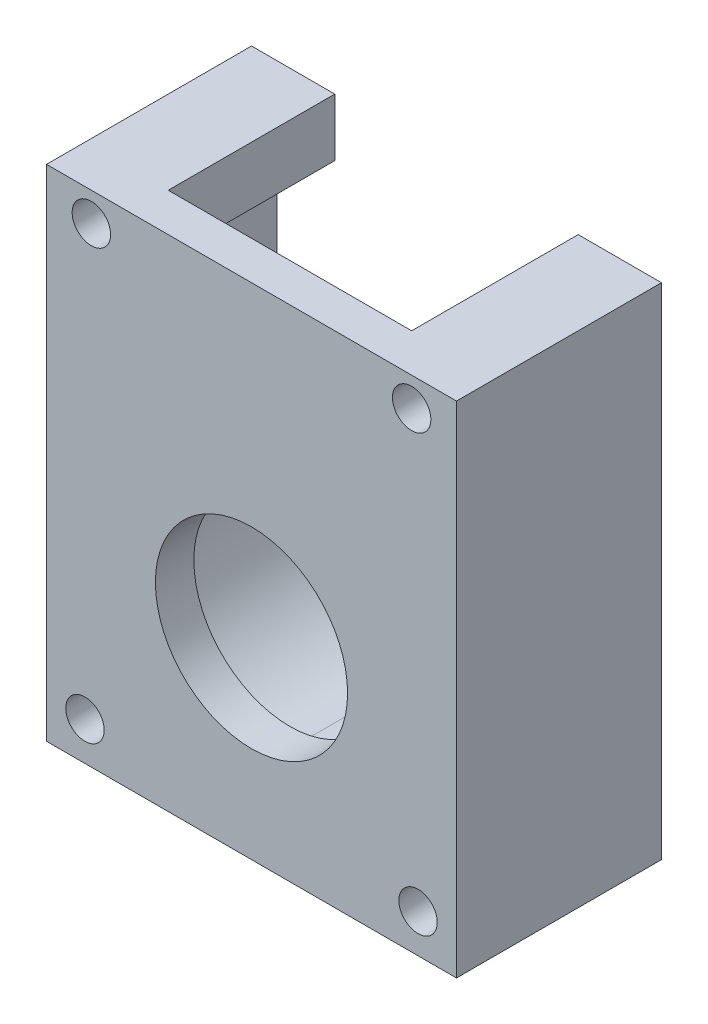
ISO-10303-21;
HEADER;
FILE_DESCRIPTION(('STEP AP214'),'2;1');
FILE_NAME('part.step','',(''),(''),'','','');
FILE_SCHEMA(('AUTOMOTIVE_DESIGN { 1 0 10303 214 1 1 1 1 }'));
ENDSEC;
DATA;
#1=APPLICATION_CONTEXT('core data for automotive mechanical design processes');
#2=APPLICATION_PROTOCOL_DEFINITION('international standard','automotive_design',2000,#1);
#3=PRODUCT_CONTEXT('',#1,'mechanical');
#4=PRODUCT('Part','Part','',(#3));
#5=PRODUCT_RELATED_PRODUCT_CATEGORY('part','',(#4));
#6=PRODUCT_DEFINITION_FORMATION('','',#4);
#7=PRODUCT_DEFINITION_CONTEXT('part definition',#1,'design');
#8=PRODUCT_DEFINITION('design','',#6,#7);
#9=PRODUCT_DEFINITION_SHAPE('','',#8);
#10=(LENGTH_UNIT() NAMED_UNIT(*) SI_UNIT(.MILLI.,.METRE.));
#11=(NAMED_UNIT(*) PLANE_ANGLE_UNIT() SI_UNIT($,.RADIAN.));
#12=(NAMED_UNIT(*) SI_UNIT($,.STERADIAN.) SOLID_ANGLE_UNIT());
#13=UNCERTAINTY_MEASURE_WITH_UNIT(LENGTH_MEASURE(1.E-05),#10,'distance_accuracy_value','');
#14=(GEOMETRIC_REPRESENTATION_CONTEXT(3) GLOBAL_UNCERTAINTY_ASSIGNED_CONTEXT((#13)) GLOBAL_UNIT_ASSIGNED_CONTEXT((#10,
#11,#12)) REPRESENTATION_CONTEXT('',''));
#15=CARTESIAN_POINT('',(0.,0.,0.));
#16=DIRECTION('',(0.,0.,1.));
#17=DIRECTION('',(1.,0.,0.));
#18=AXIS2_PLACEMENT_3D('',#15,#16,#17);
#19=CARTESIAN_POINT('',(14.,0.,19.));
#20=DIRECTION('',(-1.,0.,0.));
#21=DIRECTION('',(0.,0.,1.));
#22=AXIS2_PLACEMENT_3D('',#19,#20,#21);
#23=PLANE('',#22);
#24=DIRECTION('',(0.,0.,-1.));
#25=VECTOR('',#24,1.);
#26=CARTESIAN_POINT('',(14.,-3.,19.));
#27=LINE('',#26,#25);
#28=CARTESIAN_POINT('',(14.,-3.,0.));
#29=VERTEX_POINT('',#28);
#30=CARTESIAN_POINT('',(14.,-3.,13.));
#31=VERTEX_POINT('',#30);
#32=EDGE_CURVE('E193',#29,#31,#27,.F.);
#33=ORIENTED_EDGE('',*,*,#32,.T.);
#34=DIRECTION('',(0.,1.,0.));
#35=VECTOR('',#34,1.);
#36=CARTESIAN_POINT('',(14.,0.,13.));
#37=LINE('',#36,#35);
#38=CARTESIAN_POINT('',(14.,18.5,13.));
#39=VERTEX_POINT('',#38);
#40=EDGE_CURVE('E335',#31,#39,#37,.T.);
#41=ORIENTED_EDGE('',*,*,#40,.T.);
#42=DIRECTION('',(0.,0.,1.));
#43=VECTOR('',#42,1.);
#44=CARTESIAN_POINT('',(14.,18.5,0.));
#45=LINE('',#44,#43);
#46=CARTESIAN_POINT('',(14.,18.5,0.));
#47=VERTEX_POINT('',#46);
#48=EDGE_CURVE('E206',#39,#47,#45,.F.);
#49=ORIENTED_EDGE('',*,*,#48,.T.);
#50=DIRECTION('',(0.,1.,0.));
#51=VECTOR('',#50,1.);
#52=CARTESIAN_POINT('',(14.,0.,0.));
#53=LINE('',#52,#51);
#54=EDGE_CURVE('E266',#29,#47,#53,.T.);
#55=ORIENTED_EDGE('',*,*,#54,.F.);
#56=EDGE_LOOP('',(#33,#41,#49,#55));
#57=FACE_BOUND('',#56,.T.);
#58=ADVANCED_FACE('F39',(#57),#23,.T.);
#59=CARTESIAN_POINT('',(0.,-13.,19.));
#60=DIRECTION('',(0.,1.,0.));
#61=DIRECTION('',(0.,0.,1.));
#62=AXIS2_PLACEMENT_3D('',#59,#60,#61);
#63=PLANE('',#62);
#64=DIRECTION('',(0.,0.,-1.));
#65=VECTOR('',#64,1.);
#66=CARTESIAN_POINT('',(-4.,-13.,19.));
#67=LINE('',#66,#65);
#68=CARTESIAN_POINT('',(-4.,-13.,0.));
#69=VERTEX_POINT('',#68);
#70=CARTESIAN_POINT('',(-4.,-13.,13.));
#71=VERTEX_POINT('',#70);
#72=EDGE_CURVE('E186',#69,#71,#67,.F.);
#73=ORIENTED_EDGE('',*,*,#72,.T.);
#74=DIRECTION('',(1.,0.,0.));
#75=VECTOR('',#74,1.);
#76=CARTESIAN_POINT('',(0.,-13.,13.));
#77=LINE('',#76,#75);
#78=CARTESIAN_POINT('',(4.,-13.,13.));
#79=VERTEX_POINT('',#78);
#80=EDGE_CURVE('E312',#71,#79,#77,.T.);
#81=ORIENTED_EDGE('',*,*,#80,.T.);
#82=DIRECTION('',(0.,0.,-1.));
#83=VECTOR('',#82,1.);
#84=CARTESIAN_POINT('',(4.,-13.,0.));
#85=LINE('',#84,#83);
#86=CARTESIAN_POINT('',(4.,-13.,0.));
#87=VERTEX_POINT('',#86);
#88=EDGE_CURVE('E191',#79,#87,#85,.T.);
#89=ORIENTED_EDGE('',*,*,#88,.T.);
#90=DIRECTION('',(1.,0.,0.));
#91=VECTOR('',#90,1.);
#92=CARTESIAN_POINT('',(0.,-13.,0.));
#93=LINE('',#92,#91);
#94=EDGE_CURVE('E269',#69,#87,#93,.T.);
#95=ORIENTED_EDGE('',*,*,#94,.F.);
#96=EDGE_LOOP('',(#73,#81,#89,#95));
#97=FACE_BOUND('',#96,.T.);
#98=ADVANCED_FACE('F342',(#97),#63,.T.);
#99=CARTESIAN_POINT('',(-14.,0.,19.));
#100=DIRECTION('',(-1.,0.,0.));
#101=DIRECTION('',(0.,0.,1.));
#102=AXIS2_PLACEMENT_3D('',#99,#100,#101);
#103=PLANE('',#102);
#104=DIRECTION('',(0.,1.,0.));
#105=VECTOR('',#104,1.);
#106=CARTESIAN_POINT('',(-14.,0.,13.));
#107=LINE('',#106,#105);
#108=CARTESIAN_POINT('',(-14.,-3.,13.));
#109=VERTEX_POINT('',#108);
#110=CARTESIAN_POINT('',(-14.,18.5,13.));
#111=VERTEX_POINT('',#110);
#112=EDGE_CURVE('E301',#109,#111,#107,.T.);
#113=ORIENTED_EDGE('',*,*,#112,.F.);
#114=DIRECTION('',(0.,0.,-1.));
#115=VECTOR('',#114,1.);
#116=CARTESIAN_POINT('',(-14.,-3.,19.));
#117=LINE('',#116,#115);
#118=CARTESIAN_POINT('',(-14.,-3.,0.));
#119=VERTEX_POINT('',#118);
#120=EDGE_CURVE('E179',#109,#119,#117,.T.);
#121=ORIENTED_EDGE('',*,*,#120,.T.);
#122=DIRECTION('',(0.,1.,0.));
#123=VECTOR('',#122,1.);
#124=CARTESIAN_POINT('',(-14.,0.,0.));
#125=LINE('',#124,#123);
#126=CARTESIAN_POINT('',(-14.,18.5,0.));
#127=VERTEX_POINT('',#126);
#128=EDGE_CURVE('E272',#119,#127,#125,.T.);
#129=ORIENTED_EDGE('',*,*,#128,.T.);
#130=DIRECTION('',(0.,0.,1.));
#131=VECTOR('',#130,1.);
#132=CARTESIAN_POINT('',(-14.,18.5,19.));
#133=LINE('',#132,#131);
#134=EDGE_CURVE('E198',#127,#111,#133,.T.);
#135=ORIENTED_EDGE('',*,*,#134,.T.);
#136=EDGE_LOOP('',(#113,#121,#129,#135));
#137=FACE_BOUND('',#136,.T.);
#138=ADVANCED_FACE('F300',(#137),#103,.F.);
#139=CARTESIAN_POINT('',(-9.5,24.,0.));
#140=DIRECTION('',(1.,0.,0.));
#141=DIRECTION('',(0.,0.,-1.));
#142=AXIS2_PLACEMENT_3D('',#139,#140,#141);
#143=PLANE('',#142);
#144=DIRECTION('',(0.,0.,1.));
#145=VECTOR('',#144,1.);
#146=CARTESIAN_POINT('',(-9.5,24.,0.));
#147=LINE('',#146,#145);
#148=CARTESIAN_POINT('',(-9.5,24.,0.));
#149=VERTEX_POINT('',#148);
#150=CARTESIAN_POINT('',(-9.5,24.,13.));
#151=VERTEX_POINT('',#150);
#152=EDGE_CURVE('E56',#149,#151,#147,.T.);
#153=ORIENTED_EDGE('',*,*,#152,.T.);
#154=DIRECTION('',(0.,-1.,0.));
#155=VECTOR('',#154,1.);
#156=CARTESIAN_POINT('',(-9.5,24.,13.));
#157=LINE('',#156,#155);
#158=CARTESIAN_POINT('',(-9.5,19.5,13.));
#159=VERTEX_POINT('',#158);
#160=EDGE_CURVE('E60',#151,#159,#157,.T.);
#161=ORIENTED_EDGE('',*,*,#160,.T.);
#162=DIRECTION('',(0.,0.,1.));
#163=VECTOR('',#162,1.);
#164=CARTESIAN_POINT('',(-9.5,19.5,0.));
#165=LINE('',#164,#163);
#166=CARTESIAN_POINT('',(-9.5,19.5,0.));
#167=VERTEX_POINT('',#166);
#168=EDGE_CURVE('E254',#167,#159,#165,.T.);
#169=ORIENTED_EDGE('',*,*,#168,.F.);
#170=DIRECTION('',(0.,1.,0.));
#171=VECTOR('',#170,1.);
#172=CARTESIAN_POINT('',(-9.5,24.,0.));
#173=LINE('',#172,#171);
#174=EDGE_CURVE('E252',#167,#149,#173,.T.);
#175=ORIENTED_EDGE('',*,*,#174,.T.);
#176=EDGE_LOOP('',(#153,#161,#169,#175));
#177=FACE_BOUND('',#176,.T.);
#178=ADVANCED_FACE('F287',(#177),#143,.T.);
#179=CARTESIAN_POINT('',(-14.,19.5,0.));
#180=DIRECTION('',(0.,-1.,0.));
#181=DIRECTION('',(0.,0.,-1.));
#182=AXIS2_PLACEMENT_3D('',#179,#180,#181);
#183=PLANE('',#182);
#184=ORIENTED_EDGE('',*,*,#168,.T.);
#185=DIRECTION('',(-1.,0.,0.));
#186=VECTOR('',#185,1.);
#187=CARTESIAN_POINT('',(-14.,19.5,13.));
#188=LINE('',#187,#186);
#189=CARTESIAN_POINT('',(-13.,19.5,13.));
#190=VERTEX_POINT('',#189);
#191=EDGE_CURVE('E310',#159,#190,#188,.T.);
#192=ORIENTED_EDGE('',*,*,#191,.T.);
#193=DIRECTION('',(0.,0.,1.));
#194=VECTOR('',#193,1.);
#195=CARTESIAN_POINT('',(-13.,19.5,0.));
#196=LINE('',#195,#194);
#197=CARTESIAN_POINT('',(-13.,19.5,0.));
#198=VERTEX_POINT('',#197);
#199=EDGE_CURVE('E201',#190,#198,#196,.F.);
#200=ORIENTED_EDGE('',*,*,#199,.T.);
#201=DIRECTION('',(1.,0.,0.));
#202=VECTOR('',#201,1.);
#203=CARTESIAN_POINT('',(-14.,19.5,0.));
#204=LINE('',#203,#202);
#205=EDGE_CURVE('E248',#198,#167,#204,.T.);
#206=ORIENTED_EDGE('',*,*,#205,.T.);
#207=EDGE_LOOP('',(#184,#192,#200,#206));
#208=FACE_BOUND('',#207,.T.);
#209=ADVANCED_FACE('F359',(#208),#183,.T.);
#210=CARTESIAN_POINT('',(14.,19.5,0.));
#211=DIRECTION('',(0.,-1.,0.));
#212=DIRECTION('',(0.,0.,-1.));
#213=AXIS2_PLACEMENT_3D('',#210,#211,#212);
#214=PLANE('',#213);
#215=DIRECTION('',(0.,0.,1.));
#216=VECTOR('',#215,1.);
#217=CARTESIAN_POINT('',(13.,19.5,19.));
#218=LINE('',#217,#216);
#219=CARTESIAN_POINT('',(13.,19.5,0.));
#220=VERTEX_POINT('',#219);
#221=CARTESIAN_POINT('',(13.,19.5,13.));
#222=VERTEX_POINT('',#221);
#223=EDGE_CURVE('E203',#220,#222,#218,.T.);
#224=ORIENTED_EDGE('',*,*,#223,.T.);
#225=DIRECTION('',(-1.,0.,0.));
#226=VECTOR('',#225,1.);
#227=CARTESIAN_POINT('',(14.,19.5,13.));
#228=LINE('',#227,#226);
#229=CARTESIAN_POINT('',(9.5,19.5,13.));
#230=VERTEX_POINT('',#229);
#231=EDGE_CURVE('E328',#222,#230,#228,.T.);
#232=ORIENTED_EDGE('',*,*,#231,.T.);
#233=DIRECTION('',(0.,0.,1.));
#234=VECTOR('',#233,1.);
#235=CARTESIAN_POINT('',(9.5,19.5,0.));
#236=LINE('',#235,#234);
#237=CARTESIAN_POINT('',(9.5,19.5,0.));
#238=VERTEX_POINT('',#237);
#239=EDGE_CURVE('E245',#238,#230,#236,.T.);
#240=ORIENTED_EDGE('',*,*,#239,.F.);
#241=DIRECTION('',(1.,0.,0.));
#242=VECTOR('',#241,1.);
#243=CARTESIAN_POINT('',(14.,19.5,0.));
#244=LINE('',#243,#242);
#245=EDGE_CURVE('E241',#238,#220,#244,.T.);
#246=ORIENTED_EDGE('',*,*,#245,.T.);
#247=EDGE_LOOP('',(#224,#232,#240,#246));
#248=FACE_BOUND('',#247,.T.);
#249=ADVANCED_FACE('F357',(#248),#214,.T.);
#250=CARTESIAN_POINT('',(9.5,24.,0.));
#251=DIRECTION('',(-1.,0.,0.));
#252=DIRECTION('',(0.,0.,1.));
#253=AXIS2_PLACEMENT_3D('',#250,#251,#252);
#254=PLANE('',#253);
#255=ORIENTED_EDGE('',*,*,#239,.T.);
#256=DIRECTION('',(0.,1.,0.));
#257=VECTOR('',#256,1.);
#258=CARTESIAN_POINT('',(9.5,24.,13.));
#259=LINE('',#258,#257);
#260=CARTESIAN_POINT('',(9.5,24.,13.));
#261=VERTEX_POINT('',#260);
#262=EDGE_CURVE('E323',#230,#261,#259,.T.);
#263=ORIENTED_EDGE('',*,*,#262,.T.);
#264=DIRECTION('',(0.,0.,1.));
#265=VECTOR('',#264,1.);
#266=CARTESIAN_POINT('',(9.5,24.,0.));
#267=LINE('',#266,#265);
#268=CARTESIAN_POINT('',(9.5,24.,0.));
#269=VERTEX_POINT('',#268);
#270=EDGE_CURVE('E244',#269,#261,#267,.T.);
#271=ORIENTED_EDGE('',*,*,#270,.F.);
#272=DIRECTION('',(0.,-1.,0.));
#273=VECTOR('',#272,1.);
#274=CARTESIAN_POINT('',(9.5,24.,0.));
#275=LINE('',#274,#273);
#276=EDGE_CURVE('E238',#269,#238,#275,.T.);
#277=ORIENTED_EDGE('',*,*,#276,.T.);
#278=EDGE_LOOP('',(#255,#263,#271,#277));
#279=FACE_BOUND('',#278,.T.);
#280=ADVANCED_FACE('F321',(#279),#254,.T.);
#281=CARTESIAN_POINT('',(-4.,-3.,19.));
#282=DIRECTION('',(0.,0.,-1.));
#283=DIRECTION('',(-1.,0.,0.));
#284=AXIS2_PLACEMENT_3D('',#281,#282,#283);
#285=CYLINDRICAL_SURFACE('',#284,10.);
#286=CARTESIAN_POINT('',(-4.,-3.,13.));
#287=DIRECTION('',(0.,0.,1.));
#288=DIRECTION('',(1.,0.,0.));
#289=AXIS2_PLACEMENT_3D('',#286,#287,#288);
#290=CIRCLE('',#289,10.);
#291=EDGE_CURVE('E308',#71,#109,#290,.F.);
#292=ORIENTED_EDGE('',*,*,#291,.F.);
#293=ORIENTED_EDGE('',*,*,#72,.F.);
#294=CARTESIAN_POINT('',(-4.,-3.,0.));
#295=DIRECTION('',(0.,0.,1.));
#296=DIRECTION('',(1.,0.,0.));
#297=AXIS2_PLACEMENT_3D('',#294,#295,#296);
#298=CIRCLE('',#297,10.);
#299=EDGE_CURVE('E189',#119,#69,#298,.T.);
#300=ORIENTED_EDGE('',*,*,#299,.F.);
#301=ORIENTED_EDGE('',*,*,#120,.F.);
#302=EDGE_LOOP('',(#292,#293,#300,#301));
#303=FACE_BOUND('',#302,.T.);
#304=ADVANCED_FACE('F365',(#303),#285,.F.);
#305=CARTESIAN_POINT('',(4.,-3.,19.));
#306=DIRECTION('',(0.,0.,1.));
#307=DIRECTION('',(1.,0.,0.));
#308=AXIS2_PLACEMENT_3D('',#305,#306,#307);
#309=CYLINDRICAL_SURFACE('',#308,10.);
#310=CARTESIAN_POINT('',(4.,-3.,13.));
#311=DIRECTION('',(0.,0.,1.));
#312=DIRECTION('',(1.,0.,0.));
#313=AXIS2_PLACEMENT_3D('',#310,#311,#312);
#314=CIRCLE('',#313,10.);
#315=EDGE_CURVE('E337',#31,#79,#314,.F.);
#316=ORIENTED_EDGE('',*,*,#315,.F.);
#317=ORIENTED_EDGE('',*,*,#32,.F.);
#318=CARTESIAN_POINT('',(4.,-3.,0.));
#319=DIRECTION('',(0.,0.,1.));
#320=DIRECTION('',(1.,0.,0.));
#321=AXIS2_PLACEMENT_3D('',#318,#319,#320);
#322=CIRCLE('',#321,10.);
#323=EDGE_CURVE('E196',#87,#29,#322,.T.);
#324=ORIENTED_EDGE('',*,*,#323,.F.);
#325=ORIENTED_EDGE('',*,*,#88,.F.);
#326=EDGE_LOOP('',(#316,#317,#324,#325));
#327=FACE_BOUND('',#326,.T.);
#328=ADVANCED_FACE('F347',(#327),#309,.F.);
#329=CARTESIAN_POINT('',(-13.,18.5,19.));
#330=DIRECTION('',(0.,0.,1.));
#331=DIRECTION('',(1.,0.,0.));
#332=AXIS2_PLACEMENT_3D('',#329,#330,#331);
#333=CYLINDRICAL_SURFACE('',#332,1.);
#334=CARTESIAN_POINT('',(-13.,18.5,13.));
#335=DIRECTION('',(0.,0.,1.));
#336=DIRECTION('',(1.,0.,0.));
#337=AXIS2_PLACEMENT_3D('',#334,#335,#336);
#338=CIRCLE('',#337,1.);
#339=EDGE_CURVE('E297',#111,#190,#338,.F.);
#340=ORIENTED_EDGE('',*,*,#339,.F.);
#341=ORIENTED_EDGE('',*,*,#134,.F.);
#342=CARTESIAN_POINT('',(-13.,18.5,0.));
#343=DIRECTION('',(0.,0.,1.));
#344=DIRECTION('',(1.,0.,0.));
#345=AXIS2_PLACEMENT_3D('',#342,#343,#344);
#346=CIRCLE('',#345,1.);
#347=EDGE_CURVE('E48',#198,#127,#346,.T.);
#348=ORIENTED_EDGE('',*,*,#347,.F.);
#349=ORIENTED_EDGE('',*,*,#199,.F.);
#350=EDGE_LOOP('',(#340,#341,#348,#349));
#351=FACE_BOUND('',#350,.T.);
#352=ADVANCED_FACE('F295',(#351),#333,.F.);
#353=CARTESIAN_POINT('',(13.,18.5,0.));
#354=DIRECTION('',(0.,0.,-1.));
#355=DIRECTION('',(-1.,0.,0.));
#356=AXIS2_PLACEMENT_3D('',#353,#354,#355);
#357=CYLINDRICAL_SURFACE('',#356,1.);
#358=CARTESIAN_POINT('',(13.,18.5,13.));
#359=DIRECTION('',(0.,0.,1.));
#360=DIRECTION('',(1.,0.,0.));
#361=AXIS2_PLACEMENT_3D('',#358,#359,#360);
#362=CIRCLE('',#361,1.);
#363=EDGE_CURVE('E325',#222,#39,#362,.F.);
#364=ORIENTED_EDGE('',*,*,#363,.F.);
#365=ORIENTED_EDGE('',*,*,#223,.F.);
#366=CARTESIAN_POINT('',(13.,18.5,0.));
#367=DIRECTION('',(0.,0.,1.));
#368=DIRECTION('',(1.,0.,0.));
#369=AXIS2_PLACEMENT_3D('',#366,#367,#368);
#370=CIRCLE('',#369,1.);
#371=EDGE_CURVE('E11',#47,#220,#370,.T.);
#372=ORIENTED_EDGE('',*,*,#371,.F.);
#373=ORIENTED_EDGE('',*,*,#48,.F.);
#374=EDGE_LOOP('',(#364,#365,#372,#373));
#375=FACE_BOUND('',#374,.T.);
#376=ADVANCED_FACE('F41',(#375),#357,.F.);
#377=CARTESIAN_POINT('',(-16.,0.,19.));
#378=DIRECTION('',(-1.,0.,0.));
#379=DIRECTION('',(0.,0.,1.));
#380=AXIS2_PLACEMENT_3D('',#377,#378,#379);
#381=PLANE('',#380);
#382=DIRECTION('',(0.,0.,-1.));
#383=VECTOR('',#382,1.);
#384=CARTESIAN_POINT('',(-16.,24.,19.));
#385=LINE('',#384,#383);
#386=CARTESIAN_POINT('',(-16.,24.,16.));
#387=VERTEX_POINT('',#386);
#388=CARTESIAN_POINT('',(-16.,24.,0.));
#389=VERTEX_POINT('',#388);
#390=EDGE_CURVE('E181',#387,#389,#385,.T.);
#391=ORIENTED_EDGE('',*,*,#390,.T.);
#392=DIRECTION('',(0.,1.,0.));
#393=VECTOR('',#392,1.);
#394=CARTESIAN_POINT('',(-16.,0.,0.));
#395=LINE('',#394,#393);
#396=CARTESIAN_POINT('',(-16.,-15.,0.));
#397=VERTEX_POINT('',#396);
#398=EDGE_CURVE('E256',#397,#389,#395,.T.);
#399=ORIENTED_EDGE('',*,*,#398,.F.);
#400=DIRECTION('',(0.,0.,-1.));
#401=VECTOR('',#400,1.);
#402=CARTESIAN_POINT('',(-16.,-15.,19.));
#403=LINE('',#402,#401);
#404=CARTESIAN_POINT('',(-16.,-15.,16.));
#405=VERTEX_POINT('',#404);
#406=EDGE_CURVE('E177',#405,#397,#403,.T.);
#407=ORIENTED_EDGE('',*,*,#406,.F.);
#408=DIRECTION('',(0.,1.,0.));
#409=VECTOR('',#408,1.);
#410=CARTESIAN_POINT('',(-16.,-15.,16.));
#411=LINE('',#410,#409);
#412=EDGE_CURVE('E160',#405,#387,#411,.T.);
#413=ORIENTED_EDGE('',*,*,#412,.T.);
#414=EDGE_LOOP('',(#391,#399,#407,#413));
#415=FACE_BOUND('',#414,.T.);
#416=ADVANCED_FACE('F277',(#415),#381,.T.);
#417=CARTESIAN_POINT('',(0.,-15.,19.));
#418=DIRECTION('',(0.,1.,0.));
#419=DIRECTION('',(0.,0.,1.));
#420=AXIS2_PLACEMENT_3D('',#417,#418,#419);
#421=PLANE('',#420);
#422=ORIENTED_EDGE('',*,*,#406,.T.);
#423=DIRECTION('',(1.,0.,0.));
#424=VECTOR('',#423,1.);
#425=CARTESIAN_POINT('',(0.,-15.,0.));
#426=LINE('',#425,#424);
#427=CARTESIAN_POINT('',(16.,-15.,0.));
#428=VERTEX_POINT('',#427);
#429=EDGE_CURVE('E175',#397,#428,#426,.T.);
#430=ORIENTED_EDGE('',*,*,#429,.T.);
#431=DIRECTION('',(0.,0.,-1.));
#432=VECTOR('',#431,1.);
#433=CARTESIAN_POINT('',(16.,-15.,19.));
#434=LINE('',#433,#432);
#435=CARTESIAN_POINT('',(16.,-15.,16.));
#436=VERTEX_POINT('',#435);
#437=EDGE_CURVE('E169',#436,#428,#434,.T.);
#438=ORIENTED_EDGE('',*,*,#437,.F.);
#439=DIRECTION('',(-1.,0.,0.));
#440=VECTOR('',#439,1.);
#441=CARTESIAN_POINT('',(-16.,-15.,16.));
#442=LINE('',#441,#440);
#443=EDGE_CURVE('E153',#436,#405,#442,.T.);
#444=ORIENTED_EDGE('',*,*,#443,.T.);
#445=EDGE_LOOP('',(#422,#430,#438,#444));
#446=FACE_BOUND('',#445,.T.);
#447=ADVANCED_FACE('F173',(#446),#421,.F.);
#448=CARTESIAN_POINT('',(16.,0.,19.));
#449=DIRECTION('',(-1.,0.,0.));
#450=DIRECTION('',(0.,0.,1.));
#451=AXIS2_PLACEMENT_3D('',#448,#449,#450);
#452=PLANE('',#451);
#453=ORIENTED_EDGE('',*,*,#437,.T.);
#454=DIRECTION('',(0.,1.,0.));
#455=VECTOR('',#454,1.);
#456=CARTESIAN_POINT('',(16.,0.,0.));
#457=LINE('',#456,#455);
#458=CARTESIAN_POINT('',(16.,24.,0.));
#459=VERTEX_POINT('',#458);
#460=EDGE_CURVE('E261',#428,#459,#457,.T.);
#461=ORIENTED_EDGE('',*,*,#460,.T.);
#462=DIRECTION('',(0.,0.,-1.));
#463=VECTOR('',#462,1.);
#464=CARTESIAN_POINT('',(16.,24.,19.));
#465=LINE('',#464,#463);
#466=CARTESIAN_POINT('',(16.,24.,16.));
#467=VERTEX_POINT('',#466);
#468=EDGE_CURVE('E171',#467,#459,#465,.T.);
#469=ORIENTED_EDGE('',*,*,#468,.F.);
#470=DIRECTION('',(0.,1.,0.));
#471=VECTOR('',#470,1.);
#472=CARTESIAN_POINT('',(16.,-15.,16.));
#473=LINE('',#472,#471);
#474=EDGE_CURVE('E157',#436,#467,#473,.T.);
#475=ORIENTED_EDGE('',*,*,#474,.F.);
#476=EDGE_LOOP('',(#453,#461,#469,#475));
#477=FACE_BOUND('',#476,.T.);
#478=ADVANCED_FACE('F167',(#477),#452,.F.);
#479=CARTESIAN_POINT('',(0.,24.,19.));
#480=DIRECTION('',(0.,1.,0.));
#481=DIRECTION('',(0.,0.,1.));
#482=AXIS2_PLACEMENT_3D('',#479,#480,#481);
#483=PLANE('',#482);
#484=DIRECTION('',(-1.,0.,0.));
#485=VECTOR('',#484,1.);
#486=CARTESIAN_POINT('',(-16.,24.,13.));
#487=LINE('',#486,#485);
#488=EDGE_CURVE('E286',#261,#151,#487,.T.);
#489=ORIENTED_EDGE('',*,*,#488,.T.);
#490=ORIENTED_EDGE('',*,*,#152,.F.);
#491=DIRECTION('',(1.,0.,0.));
#492=VECTOR('',#491,1.);
#493=CARTESIAN_POINT('',(0.,24.,0.));
#494=LINE('',#493,#492);
#495=EDGE_CURVE('E275',#389,#149,#494,.T.);
#496=ORIENTED_EDGE('',*,*,#495,.F.);
#497=ORIENTED_EDGE('',*,*,#390,.F.);
#498=DIRECTION('',(-1.,0.,0.));
#499=VECTOR('',#498,1.);
#500=CARTESIAN_POINT('',(-16.,24.,16.));
#501=LINE('',#500,#499);
#502=EDGE_CURVE('E164',#467,#387,#501,.T.);
#503=ORIENTED_EDGE('',*,*,#502,.F.);
#504=ORIENTED_EDGE('',*,*,#468,.T.);
#505=DIRECTION('',(1.,0.,0.));
#506=VECTOR('',#505,1.);
#507=CARTESIAN_POINT('',(0.,24.,0.));
#508=LINE('',#507,#506);
#509=EDGE_CURVE('E263',#269,#459,#508,.T.);
#510=ORIENTED_EDGE('',*,*,#509,.F.);
#511=ORIENTED_EDGE('',*,*,#270,.T.);
#512=EDGE_LOOP('',(#489,#490,#496,#497,#503,#504,#510,#511));
#513=FACE_BOUND('',#512,.T.);
#514=ADVANCED_FACE('F284',(#513),#483,.T.);
#515=CARTESIAN_POINT('',(0.,0.,0.));
#516=DIRECTION('',(0.,0.,1.));
#517=DIRECTION('',(1.,0.,0.));
#518=AXIS2_PLACEMENT_3D('',#515,#516,#517);
#519=PLANE('',#518);
#520=CARTESIAN_POINT('',(13.,-12.,0.));
#521=DIRECTION('',(0.,0.,1.));
#522=DIRECTION('',(-1.,0.,0.));
#523=AXIS2_PLACEMENT_3D('',#520,#521,#522);
#524=CIRCLE('',#523,1.5);
#525=CARTESIAN_POINT('',(11.5,-12.,0.));
#526=VERTEX_POINT('',#525);
#527=EDGE_CURVE('E226',#526,#526,#524,.T.);
#528=ORIENTED_EDGE('',*,*,#527,.T.);
#529=EDGE_LOOP('',(#528));
#530=FACE_BOUND('',#529,.T.);
#531=CARTESIAN_POINT('',(12.5,21.75,0.));
#532=DIRECTION('',(0.,0.,1.));
#533=DIRECTION('',(-1.,0.,0.));
#534=AXIS2_PLACEMENT_3D('',#531,#532,#533);
#535=CIRCLE('',#534,1.5);
#536=CARTESIAN_POINT('',(11.,21.75,0.));
#537=VERTEX_POINT('',#536);
#538=EDGE_CURVE('E229',#537,#537,#535,.T.);
#539=ORIENTED_EDGE('',*,*,#538,.T.);
#540=EDGE_LOOP('',(#539));
#541=FACE_BOUND('',#540,.T.);
#542=CARTESIAN_POINT('',(-13.,-12.,0.));
#543=DIRECTION('',(0.,0.,1.));
#544=DIRECTION('',(1.,0.,0.));
#545=AXIS2_PLACEMENT_3D('',#542,#543,#544);
#546=CIRCLE('',#545,1.5);
#547=CARTESIAN_POINT('',(-11.5,-12.,0.));
#548=VERTEX_POINT('',#547);
#549=EDGE_CURVE('E232',#548,#548,#546,.T.);
#550=ORIENTED_EDGE('',*,*,#549,.T.);
#551=EDGE_LOOP('',(#550));
#552=FACE_BOUND('',#551,.T.);
#553=CARTESIAN_POINT('',(-12.5,21.75,0.));
#554=DIRECTION('',(0.,0.,1.));
#555=DIRECTION('',(1.,0.,0.));
#556=AXIS2_PLACEMENT_3D('',#553,#554,#555);
#557=CIRCLE('',#556,1.5);
#558=CARTESIAN_POINT('',(-11.,21.75,0.));
#559=VERTEX_POINT('',#558);
#560=EDGE_CURVE('E235',#559,#559,#557,.T.);
#561=ORIENTED_EDGE('',*,*,#560,.T.);
#562=EDGE_LOOP('',(#561));
#563=FACE_BOUND('',#562,.T.);
#564=ORIENTED_EDGE('',*,*,#398,.T.);
#565=ORIENTED_EDGE('',*,*,#495,.T.);
#566=ORIENTED_EDGE('',*,*,#174,.F.);
#567=ORIENTED_EDGE('',*,*,#205,.F.);
#568=ORIENTED_EDGE('',*,*,#347,.T.);
#569=ORIENTED_EDGE('',*,*,#128,.F.);
#570=ORIENTED_EDGE('',*,*,#299,.T.);
#571=ORIENTED_EDGE('',*,*,#94,.T.);
#572=ORIENTED_EDGE('',*,*,#323,.T.);
#573=ORIENTED_EDGE('',*,*,#54,.T.);
#574=ORIENTED_EDGE('',*,*,#371,.T.);
#575=ORIENTED_EDGE('',*,*,#245,.F.);
#576=ORIENTED_EDGE('',*,*,#276,.F.);
#577=ORIENTED_EDGE('',*,*,#509,.T.);
#578=ORIENTED_EDGE('',*,*,#460,.F.);
#579=ORIENTED_EDGE('',*,*,#429,.F.);
#580=EDGE_LOOP('',(#564,#565,#566,#567,#568,#569,#570,#571,#572,#573,#574,#575,#576,#577,#578,#579));
#581=FACE_BOUND('',#580,.T.);
#582=ADVANCED_FACE('F281',(#530,#541,#552,#563,#581),#519,.F.);
#583=CARTESIAN_POINT('',(-12.5,21.75,0.));
#584=DIRECTION('',(0.,0.,1.));
#585=DIRECTION('',(1.,0.,0.));
#586=AXIS2_PLACEMENT_3D('',#583,#584,#585);
#587=CYLINDRICAL_SURFACE('',#586,1.5);
#588=CARTESIAN_POINT('',(-12.5,21.75,16.));
#589=DIRECTION('',(0.,0.,-1.));
#590=DIRECTION('',(-1.,0.,0.));
#591=AXIS2_PLACEMENT_3D('',#588,#589,#590);
#592=CIRCLE('',#591,1.5);
#593=CARTESIAN_POINT('',(-14.,21.75,16.));
#594=VERTEX_POINT('',#593);
#595=EDGE_CURVE('E223',#594,#594,#592,.F.);
#596=ORIENTED_EDGE('',*,*,#595,.T.);
#597=EDGE_LOOP('',(#596));
#598=FACE_BOUND('',#597,.T.);
#599=ORIENTED_EDGE('',*,*,#560,.F.);
#600=EDGE_LOOP('',(#599));
#601=FACE_BOUND('',#600,.T.);
#602=ADVANCED_FACE('F418',(#598,#601),#587,.F.);
#603=CARTESIAN_POINT('',(-13.,-12.,0.));
#604=DIRECTION('',(0.,0.,1.));
#605=DIRECTION('',(1.,0.,0.));
#606=AXIS2_PLACEMENT_3D('',#603,#604,#605);
#607=CYLINDRICAL_SURFACE('',#606,1.5);
#608=CARTESIAN_POINT('',(-13.,-12.,16.));
#609=DIRECTION('',(0.,0.,-1.));
#610=DIRECTION('',(-1.,0.,0.));
#611=AXIS2_PLACEMENT_3D('',#608,#609,#610);
#612=CIRCLE('',#611,1.5);
#613=CARTESIAN_POINT('',(-14.5,-12.,16.));
#614=VERTEX_POINT('',#613);
#615=EDGE_CURVE('E214',#614,#614,#612,.F.);
#616=ORIENTED_EDGE('',*,*,#615,.T.);
#617=EDGE_LOOP('',(#616));
#618=FACE_BOUND('',#617,.T.);
#619=ORIENTED_EDGE('',*,*,#549,.F.);
#620=EDGE_LOOP('',(#619));
#621=FACE_BOUND('',#620,.T.);
#622=ADVANCED_FACE('F425',(#618,#621),#607,.F.);
#623=CARTESIAN_POINT('',(12.5,21.75,0.));
#624=DIRECTION('',(0.,0.,1.));
#625=DIRECTION('',(1.,0.,0.));
#626=AXIS2_PLACEMENT_3D('',#623,#624,#625);
#627=CYLINDRICAL_SURFACE('',#626,1.5);
#628=CARTESIAN_POINT('',(12.5,21.75,16.));
#629=DIRECTION('',(0.,0.,-1.));
#630=DIRECTION('',(-1.,0.,0.));
#631=AXIS2_PLACEMENT_3D('',#628,#629,#630);
#632=CIRCLE('',#631,1.5);
#633=CARTESIAN_POINT('',(11.,21.75,16.));
#634=VERTEX_POINT('',#633);
#635=EDGE_CURVE('E210',#634,#634,#632,.F.);
#636=ORIENTED_EDGE('',*,*,#635,.T.);
#637=EDGE_LOOP('',(#636));
#638=FACE_BOUND('',#637,.T.);
#639=ORIENTED_EDGE('',*,*,#538,.F.);
#640=EDGE_LOOP('',(#639));
#641=FACE_BOUND('',#640,.T.);
#642=ADVANCED_FACE('F432',(#638,#641),#627,.F.);
#643=CARTESIAN_POINT('',(13.,-12.,0.));
#644=DIRECTION('',(0.,0.,1.));
#645=DIRECTION('',(1.,0.,0.));
#646=AXIS2_PLACEMENT_3D('',#643,#644,#645);
#647=CYLINDRICAL_SURFACE('',#646,1.5);
#648=CARTESIAN_POINT('',(13.,-12.,16.));
#649=DIRECTION('',(0.,0.,-1.));
#650=DIRECTION('',(-1.,0.,0.));
#651=AXIS2_PLACEMENT_3D('',#648,#649,#650);
#652=CIRCLE('',#651,1.5);
#653=CARTESIAN_POINT('',(11.5,-12.,16.));
#654=VERTEX_POINT('',#653);
#655=EDGE_CURVE('E208',#654,#654,#652,.F.);
#656=ORIENTED_EDGE('',*,*,#655,.T.);
#657=EDGE_LOOP('',(#656));
#658=FACE_BOUND('',#657,.T.);
#659=ORIENTED_EDGE('',*,*,#527,.F.);
#660=EDGE_LOOP('',(#659));
#661=FACE_BOUND('',#660,.T.);
#662=ADVANCED_FACE('F440',(#658,#661),#647,.F.);
#663=CARTESIAN_POINT('',(-16.,-15.,16.));
#664=DIRECTION('',(0.,0.,-1.));
#665=DIRECTION('',(-1.,0.,0.));
#666=AXIS2_PLACEMENT_3D('',#663,#664,#665);
#667=PLANE('',#666);
#668=CARTESIAN_POINT('',(0.,0.,16.));
#669=DIRECTION('',(0.,0.,1.));
#670=DIRECTION('',(1.,0.,0.));
#671=AXIS2_PLACEMENT_3D('',#668,#669,#670);
#672=CIRCLE('',#671,7.5);
#673=CARTESIAN_POINT('',(7.5,0.,16.));
#674=VERTEX_POINT('',#673);
#675=EDGE_CURVE('E331',#674,#674,#672,.T.);
#676=ORIENTED_EDGE('',*,*,#675,.F.);
#677=EDGE_LOOP('',(#676));
#678=FACE_BOUND('',#677,.T.);
#679=ORIENTED_EDGE('',*,*,#474,.T.);
#680=ORIENTED_EDGE('',*,*,#502,.T.);
#681=ORIENTED_EDGE('',*,*,#412,.F.);
#682=ORIENTED_EDGE('',*,*,#443,.F.);
#683=EDGE_LOOP('',(#679,#680,#681,#682));
#684=FACE_BOUND('',#683,.T.);
#685=ORIENTED_EDGE('',*,*,#615,.F.);
#686=EDGE_LOOP('',(#685));
#687=FACE_BOUND('',#686,.T.);
#688=ORIENTED_EDGE('',*,*,#655,.F.);
#689=EDGE_LOOP('',(#688));
#690=FACE_BOUND('',#689,.T.);
#691=ORIENTED_EDGE('',*,*,#635,.F.);
#692=EDGE_LOOP('',(#691));
#693=FACE_BOUND('',#692,.T.);
#694=ORIENTED_EDGE('',*,*,#595,.F.);
#695=EDGE_LOOP('',(#694));
#696=FACE_BOUND('',#695,.T.);
#697=ADVANCED_FACE('F155',(#678,#684,#687,#690,#693,#696),#667,.F.);
#698=CARTESIAN_POINT('',(0.,0.,13.));
#699=DIRECTION('',(0.,0.,1.));
#700=DIRECTION('',(1.,0.,0.));
#701=AXIS2_PLACEMENT_3D('',#698,#699,#700);
#702=PLANE('',#701);
#703=CARTESIAN_POINT('',(0.,0.,13.));
#704=DIRECTION('',(0.,0.,1.));
#705=DIRECTION('',(1.,0.,0.));
#706=AXIS2_PLACEMENT_3D('',#703,#704,#705);
#707=CIRCLE('',#706,7.5);
#708=CARTESIAN_POINT('',(7.5,0.,13.));
#709=VERTEX_POINT('',#708);
#710=EDGE_CURVE('E43',#709,#709,#707,.T.);
#711=ORIENTED_EDGE('',*,*,#710,.T.);
#712=EDGE_LOOP('',(#711));
#713=FACE_BOUND('',#712,.T.);
#714=ORIENTED_EDGE('',*,*,#160,.F.);
#715=ORIENTED_EDGE('',*,*,#488,.F.);
#716=ORIENTED_EDGE('',*,*,#262,.F.);
#717=ORIENTED_EDGE('',*,*,#231,.F.);
#718=ORIENTED_EDGE('',*,*,#363,.T.);
#719=ORIENTED_EDGE('',*,*,#40,.F.);
#720=ORIENTED_EDGE('',*,*,#315,.T.);
#721=ORIENTED_EDGE('',*,*,#80,.F.);
#722=ORIENTED_EDGE('',*,*,#291,.T.);
#723=ORIENTED_EDGE('',*,*,#112,.T.);
#724=ORIENTED_EDGE('',*,*,#339,.T.);
#725=ORIENTED_EDGE('',*,*,#191,.F.);
#726=EDGE_LOOP('',(#714,#715,#716,#717,#718,#719,#720,#721,#722,#723,#724,#725));
#727=FACE_BOUND('',#726,.T.);
#728=ADVANCED_FACE('F305',(#713,#727),#702,.F.);
#729=CARTESIAN_POINT('',(0.,0.,0.));
#730=DIRECTION('',(0.,0.,1.));
#731=DIRECTION('',(1.,0.,0.));
#732=AXIS2_PLACEMENT_3D('',#729,#730,#731);
#733=CYLINDRICAL_SURFACE('',#732,7.5);
#734=ORIENTED_EDGE('',*,*,#675,.T.);
#735=EDGE_LOOP('',(#734));
#736=FACE_BOUND('',#735,.T.);
#737=ORIENTED_EDGE('',*,*,#710,.F.);
#738=EDGE_LOOP('',(#737));
#739=FACE_BOUND('',#738,.T.);
#740=ADVANCED_FACE('F461',(#736,#739),#733,.F.);
#741=CLOSED_SHELL('',(#58,#98,#138,#178,#209,#249,#280,#304,#328,#352,#376,#416,#447,#478,#514,
#582,#602,#622,#642,#662,#697,#728,#740));
#742=MANIFOLD_SOLID_BREP('B2',#741);
#743=ADVANCED_BREP_SHAPE_REPRESENTATION('',(#18,#742),#14);
#744=SHAPE_DEFINITION_REPRESENTATION(#9,#743);
ENDSEC;
END-ISO-10303-21;
